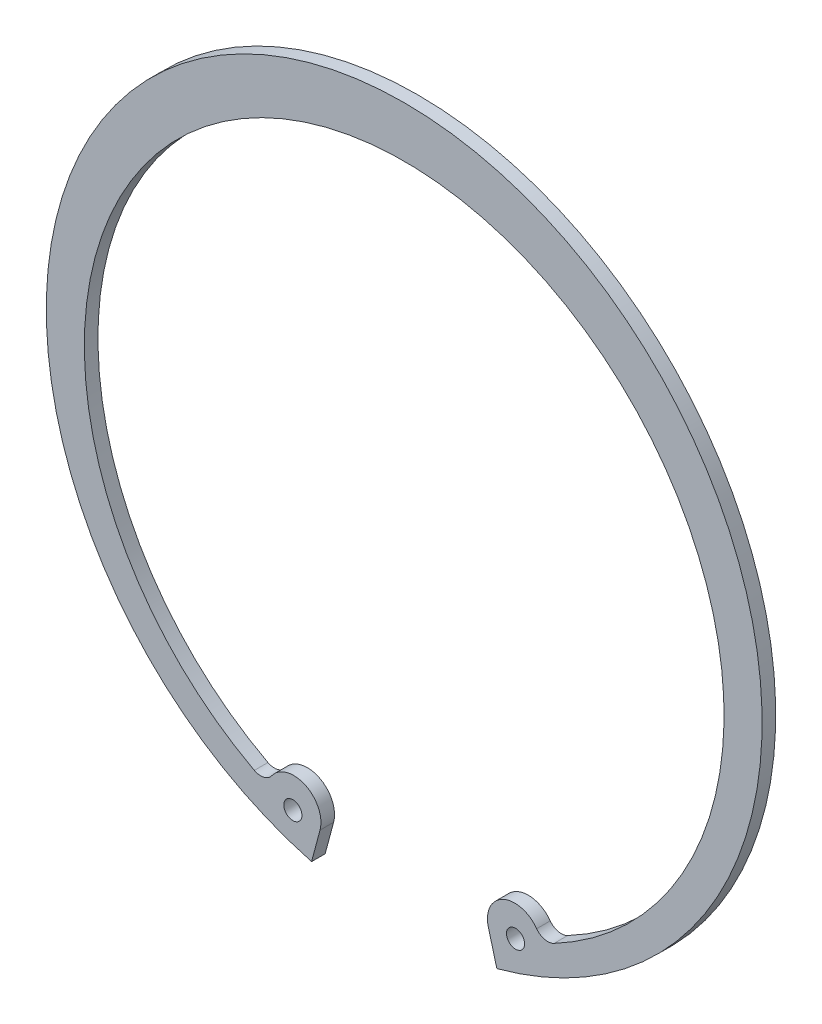
ISO-10303-21;
HEADER;
FILE_DESCRIPTION(('STEP AP214'),'2;1');
FILE_NAME('part.step','',(''),(''),'','','');
FILE_SCHEMA(('AUTOMOTIVE_DESIGN { 1 0 10303 214 1 1 1 1 }'));
ENDSEC;
DATA;
#1=APPLICATION_CONTEXT('core data for automotive mechanical design processes');
#2=APPLICATION_PROTOCOL_DEFINITION('international standard','automotive_design',2000,#1);
#3=PRODUCT_CONTEXT('',#1,'mechanical');
#4=PRODUCT('Part','Part','',(#3));
#5=PRODUCT_RELATED_PRODUCT_CATEGORY('part','',(#4));
#6=PRODUCT_DEFINITION_FORMATION('','',#4);
#7=PRODUCT_DEFINITION_CONTEXT('part definition',#1,'design');
#8=PRODUCT_DEFINITION('design','',#6,#7);
#9=PRODUCT_DEFINITION_SHAPE('','',#8);
#10=(LENGTH_UNIT() NAMED_UNIT(*) SI_UNIT(.MILLI.,.METRE.));
#11=(NAMED_UNIT(*) PLANE_ANGLE_UNIT() SI_UNIT($,.RADIAN.));
#12=(NAMED_UNIT(*) SI_UNIT($,.STERADIAN.) SOLID_ANGLE_UNIT());
#13=UNCERTAINTY_MEASURE_WITH_UNIT(LENGTH_MEASURE(1.E-05),#10,'distance_accuracy_value','');
#14=(GEOMETRIC_REPRESENTATION_CONTEXT(3) GLOBAL_UNCERTAINTY_ASSIGNED_CONTEXT((#13)) GLOBAL_UNIT_ASSIGNED_CONTEXT((#10,
#11,#12)) REPRESENTATION_CONTEXT('',''));
#15=CARTESIAN_POINT('',(0.,0.,0.));
#16=DIRECTION('',(0.,0.,1.));
#17=DIRECTION('',(1.,0.,0.));
#18=AXIS2_PLACEMENT_3D('',#15,#16,#17);
#19=CARTESIAN_POINT('',(-24.3786948074336,-67.8003078126199,3.));
#20=DIRECTION('',(0.,0.,1.));
#21=DIRECTION('',(1.,0.,0.));
#22=AXIS2_PLACEMENT_3D('',#19,#20,#21);
#23=PLANE('',#22);
#24=CARTESIAN_POINT('',(-24.5734786787336,-68.5272511168063,3.));
#25=DIRECTION('',(0.,0.,1.));
#26=DIRECTION('',(1.,0.,0.));
#27=AXIS2_PLACEMENT_3D('',#24,#25,#26);
#28=CIRCLE('',#27,2.);
#29=CARTESIAN_POINT('',(-22.5734786787336,-68.5272511168063,3.));
#30=VERTEX_POINT('',#29);
#31=EDGE_CURVE('E118',#30,#30,#28,.T.);
#32=ORIENTED_EDGE('',*,*,#31,.F.);
#33=EDGE_LOOP('',(#32));
#34=FACE_BOUND('',#33,.T.);
#35=CARTESIAN_POINT('',(-24.3786948074336,-67.8003078126199,3.));
#36=DIRECTION('',(0.,0.,1.));
#37=DIRECTION('',(1.,0.,0.));
#38=AXIS2_PLACEMENT_3D('',#35,#36,#37);
#39=CIRCLE('',#38,6.);
#40=CARTESIAN_POINT('',(-18.5831398496992,-69.3532220832351,3.));
#41=VERTEX_POINT('',#40);
#42=CARTESIAN_POINT('',(-29.2389402334031,-64.2820675707743,3.));
#43=VERTEX_POINT('',#42);
#44=EDGE_CURVE('E131',#41,#43,#39,.T.);
#45=ORIENTED_EDGE('',*,*,#44,.T.);
#46=CARTESIAN_POINT('',(-31.6690629463879,-62.5229474498514,3.));
#47=DIRECTION('',(0.,0.,-1.));
#48=DIRECTION('',(-1.,0.,0.));
#49=AXIS2_PLACEMENT_3D('',#46,#47,#48);
#50=CIRCLE('',#49,3.);
#51=CARTESIAN_POINT('',(-33.0744947339495,-65.1733741118271,3.));
#52=VERTEX_POINT('',#51);
#53=EDGE_CURVE('E77',#43,#52,#50,.T.);
#54=ORIENTED_EDGE('',*,*,#53,.T.);
#55=CARTESIAN_POINT('',(0.,-2.8,3.));
#56=DIRECTION('',(0.,0.,-1.));
#57=DIRECTION('',(1.,0.,0.));
#58=AXIS2_PLACEMENT_3D('',#55,#56,#57);
#59=CIRCLE('',#58,70.6);
#60=CARTESIAN_POINT('',(33.0744947339495,-65.1733741118271,3.));
#61=VERTEX_POINT('',#60);
#62=EDGE_CURVE('E146',#52,#61,#59,.T.);
#63=ORIENTED_EDGE('',*,*,#62,.T.);
#64=CARTESIAN_POINT('',(31.669062946388,-62.5229474498514,3.));
#65=DIRECTION('',(0.,0.,-1.));
#66=DIRECTION('',(1.,0.,0.));
#67=AXIS2_PLACEMENT_3D('',#64,#65,#66);
#68=CIRCLE('',#67,3.);
#69=CARTESIAN_POINT('',(29.2389402334031,-64.2820675707743,3.));
#70=VERTEX_POINT('',#69);
#71=EDGE_CURVE('E159',#61,#70,#68,.T.);
#72=ORIENTED_EDGE('',*,*,#71,.T.);
#73=CARTESIAN_POINT('',(24.3786948074337,-67.8003078126199,3.));
#74=DIRECTION('',(0.,0.,1.));
#75=DIRECTION('',(-1.,0.,0.));
#76=AXIS2_PLACEMENT_3D('',#73,#74,#75);
#77=CIRCLE('',#76,6.);
#78=CARTESIAN_POINT('',(18.5831398496992,-69.3532220832351,3.));
#79=VERTEX_POINT('',#78);
#80=EDGE_CURVE('E96',#70,#79,#77,.T.);
#81=ORIENTED_EDGE('',*,*,#80,.T.);
#82=DIRECTION('',(0.258819045102522,-0.965925826289068,0.));
#83=VECTOR('',#82,1.);
#84=CARTESIAN_POINT('',(18.5831398496992,-69.3532220832351,3.));
#85=LINE('',#84,#83);
#86=CARTESIAN_POINT('',(20.4467045630992,-76.3081402768364,3.));
#87=VERTEX_POINT('',#86);
#88=EDGE_CURVE('E90',#79,#87,#85,.T.);
#89=ORIENTED_EDGE('',*,*,#88,.T.);
#90=CARTESIAN_POINT('',(0.,0.,3.));
#91=DIRECTION('',(0.,0.,1.));
#92=DIRECTION('',(1.,0.,0.));
#93=AXIS2_PLACEMENT_3D('',#90,#91,#92);
#94=CIRCLE('',#93,79.);
#95=CARTESIAN_POINT('',(-20.4467045630992,-76.3081402768364,3.));
#96=VERTEX_POINT('',#95);
#97=EDGE_CURVE('E94',#87,#96,#94,.T.);
#98=ORIENTED_EDGE('',*,*,#97,.T.);
#99=DIRECTION('',(0.258819045102522,0.965925826289068,0.));
#100=VECTOR('',#99,1.);
#101=CARTESIAN_POINT('',(-18.5831398496992,-69.3532220832351,3.));
#102=LINE('',#101,#100);
#103=EDGE_CURVE('E34',#96,#41,#102,.T.);
#104=ORIENTED_EDGE('',*,*,#103,.T.);
#105=EDGE_LOOP('',(#45,#54,#63,#72,#81,#89,#98,#104));
#106=FACE_BOUND('',#105,.T.);
#107=CARTESIAN_POINT('',(24.5734786787336,-68.5272511168063,3.));
#108=DIRECTION('',(0.,0.,1.));
#109=DIRECTION('',(-1.,0.,0.));
#110=AXIS2_PLACEMENT_3D('',#107,#108,#109);
#111=CIRCLE('',#110,2.);
#112=CARTESIAN_POINT('',(22.5734786787336,-68.5272511168063,3.));
#113=VERTEX_POINT('',#112);
#114=EDGE_CURVE('E169',#113,#113,#111,.T.);
#115=ORIENTED_EDGE('',*,*,#114,.F.);
#116=EDGE_LOOP('',(#115));
#117=FACE_BOUND('',#116,.T.);
#118=ADVANCED_FACE('F17',(#34,#106,#117),#23,.T.);
#119=CARTESIAN_POINT('',(-24.3786948074336,-67.8003078126199,0.));
#120=DIRECTION('',(0.,0.,1.));
#121=DIRECTION('',(1.,0.,0.));
#122=AXIS2_PLACEMENT_3D('',#119,#120,#121);
#123=PLANE('',#122);
#124=CARTESIAN_POINT('',(-24.3786948074336,-67.8003078126199,0.));
#125=DIRECTION('',(0.,0.,1.));
#126=DIRECTION('',(1.,0.,0.));
#127=AXIS2_PLACEMENT_3D('',#124,#125,#126);
#128=CIRCLE('',#127,6.);
#129=CARTESIAN_POINT('',(-18.5831398496992,-69.3532220832351,0.));
#130=VERTEX_POINT('',#129);
#131=CARTESIAN_POINT('',(-29.2389402334031,-64.2820675707743,0.));
#132=VERTEX_POINT('',#131);
#133=EDGE_CURVE('E114',#130,#132,#128,.T.);
#134=ORIENTED_EDGE('',*,*,#133,.F.);
#135=DIRECTION('',(0.258819045102522,0.965925826289068,0.));
#136=VECTOR('',#135,1.);
#137=CARTESIAN_POINT('',(-18.5831398496992,-69.3532220832351,0.));
#138=LINE('',#137,#136);
#139=CARTESIAN_POINT('',(-20.4467045630992,-76.3081402768364,0.));
#140=VERTEX_POINT('',#139);
#141=EDGE_CURVE('E69',#140,#130,#138,.T.);
#142=ORIENTED_EDGE('',*,*,#141,.F.);
#143=CARTESIAN_POINT('',(0.,0.,0.));
#144=DIRECTION('',(0.,0.,1.));
#145=DIRECTION('',(1.,0.,0.));
#146=AXIS2_PLACEMENT_3D('',#143,#144,#145);
#147=CIRCLE('',#146,79.);
#148=CARTESIAN_POINT('',(20.4467045630992,-76.3081402768364,0.));
#149=VERTEX_POINT('',#148);
#150=EDGE_CURVE('E63',#149,#140,#147,.T.);
#151=ORIENTED_EDGE('',*,*,#150,.F.);
#152=DIRECTION('',(0.258819045102522,-0.965925826289068,0.));
#153=VECTOR('',#152,1.);
#154=CARTESIAN_POINT('',(18.5831398496992,-69.3532220832351,0.));
#155=LINE('',#154,#153);
#156=CARTESIAN_POINT('',(18.5831398496992,-69.3532220832351,0.));
#157=VERTEX_POINT('',#156);
#158=EDGE_CURVE('E104',#157,#149,#155,.T.);
#159=ORIENTED_EDGE('',*,*,#158,.F.);
#160=CARTESIAN_POINT('',(24.3786948074337,-67.8003078126199,0.));
#161=DIRECTION('',(0.,0.,1.));
#162=DIRECTION('',(-1.,0.,0.));
#163=AXIS2_PLACEMENT_3D('',#160,#161,#162);
#164=CIRCLE('',#163,6.);
#165=CARTESIAN_POINT('',(29.2389402334031,-64.2820675707743,0.));
#166=VERTEX_POINT('',#165);
#167=EDGE_CURVE('E125',#166,#157,#164,.T.);
#168=ORIENTED_EDGE('',*,*,#167,.F.);
#169=CARTESIAN_POINT('',(31.669062946388,-62.5229474498514,0.));
#170=DIRECTION('',(0.,0.,-1.));
#171=DIRECTION('',(1.,0.,0.));
#172=AXIS2_PLACEMENT_3D('',#169,#170,#171);
#173=CIRCLE('',#172,3.);
#174=CARTESIAN_POINT('',(33.0744947339495,-65.1733741118271,0.));
#175=VERTEX_POINT('',#174);
#176=EDGE_CURVE('E123',#175,#166,#173,.T.);
#177=ORIENTED_EDGE('',*,*,#176,.F.);
#178=CARTESIAN_POINT('',(0.,-2.8,0.));
#179=DIRECTION('',(0.,0.,-1.));
#180=DIRECTION('',(1.,0.,0.));
#181=AXIS2_PLACEMENT_3D('',#178,#179,#180);
#182=CIRCLE('',#181,70.6);
#183=CARTESIAN_POINT('',(-33.0744947339495,-65.1733741118271,0.));
#184=VERTEX_POINT('',#183);
#185=EDGE_CURVE('E120',#184,#175,#182,.T.);
#186=ORIENTED_EDGE('',*,*,#185,.F.);
#187=CARTESIAN_POINT('',(-31.6690629463879,-62.5229474498514,0.));
#188=DIRECTION('',(0.,0.,-1.));
#189=DIRECTION('',(-1.,0.,0.));
#190=AXIS2_PLACEMENT_3D('',#187,#188,#189);
#191=CIRCLE('',#190,3.);
#192=EDGE_CURVE('E117',#132,#184,#191,.T.);
#193=ORIENTED_EDGE('',*,*,#192,.F.);
#194=EDGE_LOOP('',(#134,#142,#151,#159,#168,#177,#186,#193));
#195=FACE_BOUND('',#194,.T.);
#196=CARTESIAN_POINT('',(-24.5734786787336,-68.5272511168063,0.));
#197=DIRECTION('',(0.,0.,1.));
#198=DIRECTION('',(1.,0.,0.));
#199=AXIS2_PLACEMENT_3D('',#196,#197,#198);
#200=CIRCLE('',#199,2.);
#201=CARTESIAN_POINT('',(-22.5734786787336,-68.5272511168063,0.));
#202=VERTEX_POINT('',#201);
#203=EDGE_CURVE('E166',#202,#202,#200,.T.);
#204=ORIENTED_EDGE('',*,*,#203,.T.);
#205=EDGE_LOOP('',(#204));
#206=FACE_BOUND('',#205,.T.);
#207=CARTESIAN_POINT('',(24.5734786787336,-68.5272511168063,0.));
#208=DIRECTION('',(0.,0.,1.));
#209=DIRECTION('',(-1.,0.,0.));
#210=AXIS2_PLACEMENT_3D('',#207,#208,#209);
#211=CIRCLE('',#210,2.);
#212=CARTESIAN_POINT('',(22.5734786787336,-68.5272511168063,0.));
#213=VERTEX_POINT('',#212);
#214=EDGE_CURVE('E172',#213,#213,#211,.T.);
#215=ORIENTED_EDGE('',*,*,#214,.T.);
#216=EDGE_LOOP('',(#215));
#217=FACE_BOUND('',#216,.T.);
#218=ADVANCED_FACE('F150',(#195,#206,#217),#123,.F.);
#219=CARTESIAN_POINT('',(-24.3786948074336,-67.8003078126199,3.));
#220=DIRECTION('',(0.,0.,-1.));
#221=DIRECTION('',(-1.,0.,0.));
#222=AXIS2_PLACEMENT_3D('',#219,#220,#221);
#223=CYLINDRICAL_SURFACE('',#222,6.);
#224=ORIENTED_EDGE('',*,*,#133,.T.);
#225=DIRECTION('',(0.,0.,-1.));
#226=VECTOR('',#225,1.);
#227=CARTESIAN_POINT('',(-29.2389402334031,-64.2820675707743,3.));
#228=LINE('',#227,#226);
#229=EDGE_CURVE('E11',#43,#132,#228,.T.);
#230=ORIENTED_EDGE('',*,*,#229,.F.);
#231=ORIENTED_EDGE('',*,*,#44,.F.);
#232=DIRECTION('',(0.,0.,-1.));
#233=VECTOR('',#232,1.);
#234=CARTESIAN_POINT('',(-18.5831398496992,-69.3532220832351,3.));
#235=LINE('',#234,#233);
#236=EDGE_CURVE('E110',#41,#130,#235,.T.);
#237=ORIENTED_EDGE('',*,*,#236,.T.);
#238=EDGE_LOOP('',(#224,#230,#231,#237));
#239=FACE_BOUND('',#238,.T.);
#240=ADVANCED_FACE('F19',(#239),#223,.T.);
#241=CARTESIAN_POINT('',(-31.6690629463879,-62.5229474498514,3.));
#242=DIRECTION('',(0.,0.,-1.));
#243=DIRECTION('',(-1.,0.,0.));
#244=AXIS2_PLACEMENT_3D('',#241,#242,#243);
#245=CYLINDRICAL_SURFACE('',#244,3.);
#246=ORIENTED_EDGE('',*,*,#192,.T.);
#247=DIRECTION('',(0.,0.,-1.));
#248=VECTOR('',#247,1.);
#249=CARTESIAN_POINT('',(-33.0744947339495,-65.1733741118271,3.));
#250=LINE('',#249,#248);
#251=EDGE_CURVE('E26',#52,#184,#250,.T.);
#252=ORIENTED_EDGE('',*,*,#251,.F.);
#253=ORIENTED_EDGE('',*,*,#53,.F.);
#254=ORIENTED_EDGE('',*,*,#229,.T.);
#255=EDGE_LOOP('',(#246,#252,#253,#254));
#256=FACE_BOUND('',#255,.T.);
#257=ADVANCED_FACE('F206',(#256),#245,.F.);
#258=CARTESIAN_POINT('',(0.,-2.8,3.));
#259=DIRECTION('',(0.,0.,-1.));
#260=DIRECTION('',(-1.,0.,0.));
#261=AXIS2_PLACEMENT_3D('',#258,#259,#260);
#262=CYLINDRICAL_SURFACE('',#261,70.6);
#263=ORIENTED_EDGE('',*,*,#185,.T.);
#264=DIRECTION('',(0.,0.,-1.));
#265=VECTOR('',#264,1.);
#266=CARTESIAN_POINT('',(33.0744947339495,-65.1733741118271,3.));
#267=LINE('',#266,#265);
#268=EDGE_CURVE('E138',#61,#175,#267,.T.);
#269=ORIENTED_EDGE('',*,*,#268,.F.);
#270=ORIENTED_EDGE('',*,*,#62,.F.);
#271=ORIENTED_EDGE('',*,*,#251,.T.);
#272=EDGE_LOOP('',(#263,#269,#270,#271));
#273=FACE_BOUND('',#272,.T.);
#274=ADVANCED_FACE('F144',(#273),#262,.F.);
#275=CARTESIAN_POINT('',(31.669062946388,-62.5229474498514,3.));
#276=DIRECTION('',(0.,0.,-1.));
#277=DIRECTION('',(-1.,0.,0.));
#278=AXIS2_PLACEMENT_3D('',#275,#276,#277);
#279=CYLINDRICAL_SURFACE('',#278,3.);
#280=ORIENTED_EDGE('',*,*,#176,.T.);
#281=DIRECTION('',(0.,0.,-1.));
#282=VECTOR('',#281,1.);
#283=CARTESIAN_POINT('',(29.2389402334031,-64.2820675707743,3.));
#284=LINE('',#283,#282);
#285=EDGE_CURVE('E135',#70,#166,#284,.T.);
#286=ORIENTED_EDGE('',*,*,#285,.F.);
#287=ORIENTED_EDGE('',*,*,#71,.F.);
#288=ORIENTED_EDGE('',*,*,#268,.T.);
#289=EDGE_LOOP('',(#280,#286,#287,#288));
#290=FACE_BOUND('',#289,.T.);
#291=ADVANCED_FACE('F155',(#290),#279,.F.);
#292=CARTESIAN_POINT('',(24.3786948074337,-67.8003078126199,3.));
#293=DIRECTION('',(0.,0.,-1.));
#294=DIRECTION('',(-1.,0.,0.));
#295=AXIS2_PLACEMENT_3D('',#292,#293,#294);
#296=CYLINDRICAL_SURFACE('',#295,6.);
#297=ORIENTED_EDGE('',*,*,#167,.T.);
#298=DIRECTION('',(0.,0.,-1.));
#299=VECTOR('',#298,1.);
#300=CARTESIAN_POINT('',(18.5831398496992,-69.3532220832351,3.));
#301=LINE('',#300,#299);
#302=EDGE_CURVE('E105',#79,#157,#301,.T.);
#303=ORIENTED_EDGE('',*,*,#302,.F.);
#304=ORIENTED_EDGE('',*,*,#80,.F.);
#305=ORIENTED_EDGE('',*,*,#285,.T.);
#306=EDGE_LOOP('',(#297,#303,#304,#305));
#307=FACE_BOUND('',#306,.T.);
#308=ADVANCED_FACE('F158',(#307),#296,.T.);
#309=CARTESIAN_POINT('',(18.5831398496992,-69.3532220832351,3.));
#310=DIRECTION('',(0.965925826289068,0.258819045102522,0.));
#311=DIRECTION('',(-0.258819045102522,0.965925826289068,0.));
#312=AXIS2_PLACEMENT_3D('',#309,#310,#311);
#313=PLANE('',#312);
#314=ORIENTED_EDGE('',*,*,#158,.T.);
#315=DIRECTION('',(0.,0.,-1.));
#316=VECTOR('',#315,1.);
#317=CARTESIAN_POINT('',(20.4467045630992,-76.3081402768364,3.));
#318=LINE('',#317,#316);
#319=EDGE_CURVE('E101',#87,#149,#318,.T.);
#320=ORIENTED_EDGE('',*,*,#319,.F.);
#321=ORIENTED_EDGE('',*,*,#88,.F.);
#322=ORIENTED_EDGE('',*,*,#302,.T.);
#323=EDGE_LOOP('',(#314,#320,#321,#322));
#324=FACE_BOUND('',#323,.T.);
#325=ADVANCED_FACE('F102',(#324),#313,.F.);
#326=CARTESIAN_POINT('',(0.,0.,3.));
#327=DIRECTION('',(0.,0.,-1.));
#328=DIRECTION('',(-1.,0.,0.));
#329=AXIS2_PLACEMENT_3D('',#326,#327,#328);
#330=CYLINDRICAL_SURFACE('',#329,79.);
#331=ORIENTED_EDGE('',*,*,#150,.T.);
#332=DIRECTION('',(0.,0.,-1.));
#333=VECTOR('',#332,1.);
#334=CARTESIAN_POINT('',(-20.4467045630992,-76.3081402768364,3.));
#335=LINE('',#334,#333);
#336=EDGE_CURVE('E106',#96,#140,#335,.T.);
#337=ORIENTED_EDGE('',*,*,#336,.F.);
#338=ORIENTED_EDGE('',*,*,#97,.F.);
#339=ORIENTED_EDGE('',*,*,#319,.T.);
#340=EDGE_LOOP('',(#331,#337,#338,#339));
#341=FACE_BOUND('',#340,.T.);
#342=ADVANCED_FACE('F108',(#341),#330,.T.);
#343=CARTESIAN_POINT('',(-18.5831398496992,-69.3532220832351,3.));
#344=DIRECTION('',(-0.965925826289068,0.258819045102522,0.));
#345=DIRECTION('',(-0.258819045102522,-0.965925826289068,0.));
#346=AXIS2_PLACEMENT_3D('',#343,#344,#345);
#347=PLANE('',#346);
#348=ORIENTED_EDGE('',*,*,#141,.T.);
#349=ORIENTED_EDGE('',*,*,#236,.F.);
#350=ORIENTED_EDGE('',*,*,#103,.F.);
#351=ORIENTED_EDGE('',*,*,#336,.T.);
#352=EDGE_LOOP('',(#348,#349,#350,#351));
#353=FACE_BOUND('',#352,.T.);
#354=ADVANCED_FACE('F194',(#353),#347,.F.);
#355=CARTESIAN_POINT('',(-24.5734786787336,-68.5272511168063,3.));
#356=DIRECTION('',(0.,0.,-1.));
#357=DIRECTION('',(-1.,0.,0.));
#358=AXIS2_PLACEMENT_3D('',#355,#356,#357);
#359=CYLINDRICAL_SURFACE('',#358,2.);
#360=ORIENTED_EDGE('',*,*,#31,.T.);
#361=EDGE_LOOP('',(#360));
#362=FACE_BOUND('',#361,.T.);
#363=ORIENTED_EDGE('',*,*,#203,.F.);
#364=EDGE_LOOP('',(#363));
#365=FACE_BOUND('',#364,.T.);
#366=ADVANCED_FACE('F191',(#362,#365),#359,.F.);
#367=CARTESIAN_POINT('',(24.5734786787336,-68.5272511168063,3.));
#368=DIRECTION('',(0.,0.,-1.));
#369=DIRECTION('',(-1.,0.,0.));
#370=AXIS2_PLACEMENT_3D('',#367,#368,#369);
#371=CYLINDRICAL_SURFACE('',#370,2.);
#372=ORIENTED_EDGE('',*,*,#114,.T.);
#373=EDGE_LOOP('',(#372));
#374=FACE_BOUND('',#373,.T.);
#375=ORIENTED_EDGE('',*,*,#214,.F.);
#376=EDGE_LOOP('',(#375));
#377=FACE_BOUND('',#376,.T.);
#378=ADVANCED_FACE('F178',(#374,#377),#371,.F.);
#379=CLOSED_SHELL('',(#118,#218,#240,#257,#274,#291,#308,#325,#342,#354,#366,#378));
#380=MANIFOLD_SOLID_BREP('B1',#379);
#381=ADVANCED_BREP_SHAPE_REPRESENTATION('',(#18,#380),#14);
#382=SHAPE_DEFINITION_REPRESENTATION(#9,#381);
ENDSEC;
END-ISO-10303-21;
